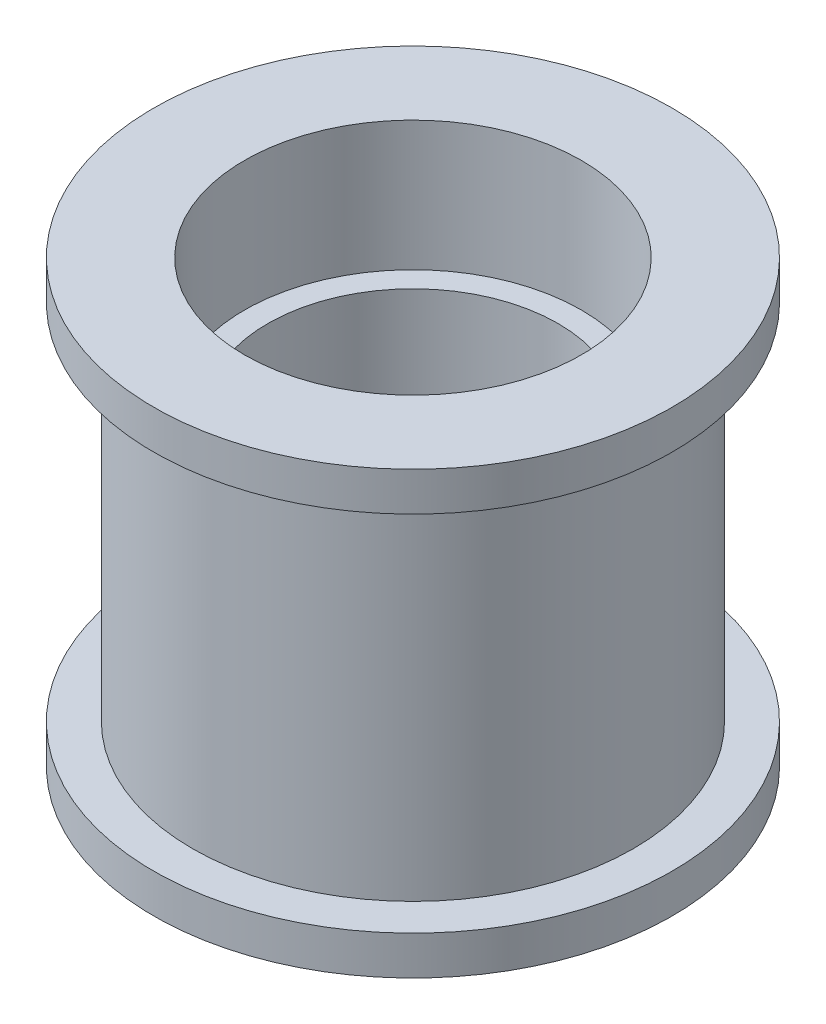
ISO-10303-21;
HEADER;
FILE_DESCRIPTION(('STEP AP214'),'2;1');
FILE_NAME('part.step','',(''),(''),'','','');
FILE_SCHEMA(('AUTOMOTIVE_DESIGN { 1 0 10303 214 1 1 1 1 }'));
ENDSEC;
DATA;
#1=APPLICATION_CONTEXT('core data for automotive mechanical design processes');
#2=APPLICATION_PROTOCOL_DEFINITION('international standard','automotive_design',2000,#1);
#3=PRODUCT_CONTEXT('',#1,'mechanical');
#4=PRODUCT('Part','Part','',(#3));
#5=PRODUCT_RELATED_PRODUCT_CATEGORY('part','',(#4));
#6=PRODUCT_DEFINITION_FORMATION('','',#4);
#7=PRODUCT_DEFINITION_CONTEXT('part definition',#1,'design');
#8=PRODUCT_DEFINITION('design','',#6,#7);
#9=PRODUCT_DEFINITION_SHAPE('','',#8);
#10=(LENGTH_UNIT() NAMED_UNIT(*) SI_UNIT(.MILLI.,.METRE.));
#11=(NAMED_UNIT(*) PLANE_ANGLE_UNIT() SI_UNIT($,.RADIAN.));
#12=(NAMED_UNIT(*) SI_UNIT($,.STERADIAN.) SOLID_ANGLE_UNIT());
#13=UNCERTAINTY_MEASURE_WITH_UNIT(LENGTH_MEASURE(1.E-05),#10,'distance_accuracy_value','');
#14=(GEOMETRIC_REPRESENTATION_CONTEXT(3) GLOBAL_UNCERTAINTY_ASSIGNED_CONTEXT((#13)) GLOBAL_UNIT_ASSIGNED_CONTEXT((#10,
#11,#12)) REPRESENTATION_CONTEXT('',''));
#15=CARTESIAN_POINT('',(0.,0.,0.));
#16=DIRECTION('',(0.,0.,1.));
#17=DIRECTION('',(1.,0.,0.));
#18=AXIS2_PLACEMENT_3D('',#15,#16,#17);
#19=CARTESIAN_POINT('',(5.6,3.5,0.));
#20=DIRECTION('',(0.,1.,0.));
#21=DIRECTION('',(0.,0.,1.));
#22=AXIS2_PLACEMENT_3D('',#19,#20,#21);
#23=PLANE('',#22);
#24=CARTESIAN_POINT('',(0.,3.5,0.));
#25=DIRECTION('',(0.,-1.,0.));
#26=DIRECTION('',(0.,0.,-1.));
#27=AXIS2_PLACEMENT_3D('',#24,#25,#26);
#28=CIRCLE('',#27,5.6);
#29=CARTESIAN_POINT('',(0.,3.5,-5.6));
#30=VERTEX_POINT('',#29);
#31=EDGE_CURVE('E10',#30,#30,#28,.T.);
#32=ORIENTED_EDGE('',*,*,#31,.T.);
#33=EDGE_LOOP('',(#32));
#34=FACE_BOUND('',#33,.T.);
#35=CARTESIAN_POINT('',(0.,3.5,0.));
#36=DIRECTION('',(0.,-1.,0.));
#37=DIRECTION('',(0.,0.,-1.));
#38=AXIS2_PLACEMENT_3D('',#35,#36,#37);
#39=CIRCLE('',#38,6.5);
#40=CARTESIAN_POINT('',(0.,3.5,-6.5));
#41=VERTEX_POINT('',#40);
#42=EDGE_CURVE('E72',#41,#41,#39,.T.);
#43=ORIENTED_EDGE('',*,*,#42,.F.);
#44=EDGE_LOOP('',(#43));
#45=FACE_BOUND('',#44,.T.);
#46=ADVANCED_FACE('F32',(#34,#45),#23,.T.);
#47=CARTESIAN_POINT('',(0.,0.,0.));
#48=DIRECTION('',(0.,-1.,0.));
#49=DIRECTION('',(0.,0.,-1.));
#50=AXIS2_PLACEMENT_3D('',#47,#48,#49);
#51=CYLINDRICAL_SURFACE('',#50,5.6);
#52=CARTESIAN_POINT('',(0.,-3.5,0.));
#53=DIRECTION('',(0.,-1.,0.));
#54=DIRECTION('',(0.,0.,-1.));
#55=AXIS2_PLACEMENT_3D('',#52,#53,#54);
#56=CIRCLE('',#55,5.6);
#57=CARTESIAN_POINT('',(0.,-3.5,-5.6));
#58=VERTEX_POINT('',#57);
#59=EDGE_CURVE('E38',#58,#58,#56,.T.);
#60=ORIENTED_EDGE('',*,*,#59,.T.);
#61=EDGE_LOOP('',(#60));
#62=FACE_BOUND('',#61,.T.);
#63=ORIENTED_EDGE('',*,*,#31,.F.);
#64=EDGE_LOOP('',(#63));
#65=FACE_BOUND('',#64,.T.);
#66=ADVANCED_FACE('F80',(#62,#65),#51,.F.);
#67=CARTESIAN_POINT('',(5.6,-3.5,0.));
#68=DIRECTION('',(0.,-1.,0.));
#69=DIRECTION('',(0.,0.,-1.));
#70=AXIS2_PLACEMENT_3D('',#67,#68,#69);
#71=PLANE('',#70);
#72=CARTESIAN_POINT('',(0.,-3.5,0.));
#73=DIRECTION('',(0.,-1.,0.));
#74=DIRECTION('',(0.,0.,-1.));
#75=AXIS2_PLACEMENT_3D('',#72,#73,#74);
#76=CIRCLE('',#75,6.5);
#77=CARTESIAN_POINT('',(0.,-3.5,-6.5));
#78=VERTEX_POINT('',#77);
#79=EDGE_CURVE('E42',#78,#78,#76,.T.);
#80=ORIENTED_EDGE('',*,*,#79,.T.);
#81=EDGE_LOOP('',(#80));
#82=FACE_BOUND('',#81,.T.);
#83=ORIENTED_EDGE('',*,*,#59,.F.);
#84=EDGE_LOOP('',(#83));
#85=FACE_BOUND('',#84,.T.);
#86=ADVANCED_FACE('F84',(#82,#85),#71,.T.);
#87=CARTESIAN_POINT('',(0.,0.,0.));
#88=DIRECTION('',(0.,-1.,0.));
#89=DIRECTION('',(0.,0.,-1.));
#90=AXIS2_PLACEMENT_3D('',#87,#88,#89);
#91=CYLINDRICAL_SURFACE('',#90,6.5);
#92=CARTESIAN_POINT('',(0.,-8.5,0.));
#93=DIRECTION('',(0.,-1.,0.));
#94=DIRECTION('',(0.,0.,-1.));
#95=AXIS2_PLACEMENT_3D('',#92,#93,#94);
#96=CIRCLE('',#95,6.5);
#97=CARTESIAN_POINT('',(0.,-8.5,-6.5));
#98=VERTEX_POINT('',#97);
#99=EDGE_CURVE('E46',#98,#98,#96,.T.);
#100=ORIENTED_EDGE('',*,*,#99,.T.);
#101=EDGE_LOOP('',(#100));
#102=FACE_BOUND('',#101,.T.);
#103=ORIENTED_EDGE('',*,*,#79,.F.);
#104=EDGE_LOOP('',(#103));
#105=FACE_BOUND('',#104,.T.);
#106=ADVANCED_FACE('F88',(#102,#105),#91,.F.);
#107=CARTESIAN_POINT('',(6.5,-8.5,0.));
#108=DIRECTION('',(0.,-1.,0.));
#109=DIRECTION('',(0.,0.,-1.));
#110=AXIS2_PLACEMENT_3D('',#107,#108,#109);
#111=PLANE('',#110);
#112=CARTESIAN_POINT('',(0.,-8.5,0.));
#113=DIRECTION('',(0.,-1.,0.));
#114=DIRECTION('',(0.,0.,-1.));
#115=AXIS2_PLACEMENT_3D('',#112,#113,#114);
#116=CIRCLE('',#115,10.);
#117=CARTESIAN_POINT('',(0.,-8.5,-10.));
#118=VERTEX_POINT('',#117);
#119=EDGE_CURVE('E51',#118,#118,#116,.T.);
#120=ORIENTED_EDGE('',*,*,#119,.T.);
#121=EDGE_LOOP('',(#120));
#122=FACE_BOUND('',#121,.T.);
#123=ORIENTED_EDGE('',*,*,#99,.F.);
#124=EDGE_LOOP('',(#123));
#125=FACE_BOUND('',#124,.T.);
#126=ADVANCED_FACE('F95',(#122,#125),#111,.T.);
#127=CARTESIAN_POINT('',(0.,0.,0.));
#128=DIRECTION('',(0.,-1.,0.));
#129=DIRECTION('',(0.,0.,-1.));
#130=AXIS2_PLACEMENT_3D('',#127,#128,#129);
#131=CYLINDRICAL_SURFACE('',#130,10.);
#132=CARTESIAN_POINT('',(0.,-7.,0.));
#133=DIRECTION('',(0.,-1.,0.));
#134=DIRECTION('',(0.,0.,-1.));
#135=AXIS2_PLACEMENT_3D('',#132,#133,#134);
#136=CIRCLE('',#135,10.);
#137=CARTESIAN_POINT('',(0.,-7.,-10.));
#138=VERTEX_POINT('',#137);
#139=EDGE_CURVE('E54',#138,#138,#136,.T.);
#140=ORIENTED_EDGE('',*,*,#139,.T.);
#141=EDGE_LOOP('',(#140));
#142=FACE_BOUND('',#141,.T.);
#143=ORIENTED_EDGE('',*,*,#119,.F.);
#144=EDGE_LOOP('',(#143));
#145=FACE_BOUND('',#144,.T.);
#146=ADVANCED_FACE('F99',(#142,#145),#131,.T.);
#147=CARTESIAN_POINT('',(10.,-7.,0.));
#148=DIRECTION('',(0.,1.,0.));
#149=DIRECTION('',(0.,0.,1.));
#150=AXIS2_PLACEMENT_3D('',#147,#148,#149);
#151=PLANE('',#150);
#152=CARTESIAN_POINT('',(0.,-7.,0.));
#153=DIRECTION('',(0.,-1.,0.));
#154=DIRECTION('',(0.,0.,-1.));
#155=AXIS2_PLACEMENT_3D('',#152,#153,#154);
#156=CIRCLE('',#155,8.5);
#157=CARTESIAN_POINT('',(0.,-7.,-8.5));
#158=VERTEX_POINT('',#157);
#159=EDGE_CURVE('E57',#158,#158,#156,.T.);
#160=ORIENTED_EDGE('',*,*,#159,.T.);
#161=EDGE_LOOP('',(#160));
#162=FACE_BOUND('',#161,.T.);
#163=ORIENTED_EDGE('',*,*,#139,.F.);
#164=EDGE_LOOP('',(#163));
#165=FACE_BOUND('',#164,.T.);
#166=ADVANCED_FACE('F103',(#162,#165),#151,.T.);
#167=CARTESIAN_POINT('',(0.,0.,0.));
#168=DIRECTION('',(0.,-1.,0.));
#169=DIRECTION('',(0.,0.,-1.));
#170=AXIS2_PLACEMENT_3D('',#167,#168,#169);
#171=CYLINDRICAL_SURFACE('',#170,8.5);
#172=CARTESIAN_POINT('',(0.,7.,0.));
#173=DIRECTION('',(0.,-1.,0.));
#174=DIRECTION('',(0.,0.,-1.));
#175=AXIS2_PLACEMENT_3D('',#172,#173,#174);
#176=CIRCLE('',#175,8.5);
#177=CARTESIAN_POINT('',(0.,7.,-8.5));
#178=VERTEX_POINT('',#177);
#179=EDGE_CURVE('E60',#178,#178,#176,.T.);
#180=ORIENTED_EDGE('',*,*,#179,.T.);
#181=EDGE_LOOP('',(#180));
#182=FACE_BOUND('',#181,.T.);
#183=ORIENTED_EDGE('',*,*,#159,.F.);
#184=EDGE_LOOP('',(#183));
#185=FACE_BOUND('',#184,.T.);
#186=ADVANCED_FACE('F107',(#182,#185),#171,.T.);
#187=CARTESIAN_POINT('',(10.,7.,0.));
#188=DIRECTION('',(0.,-1.,0.));
#189=DIRECTION('',(0.,0.,-1.));
#190=AXIS2_PLACEMENT_3D('',#187,#188,#189);
#191=PLANE('',#190);
#192=CARTESIAN_POINT('',(0.,7.,0.));
#193=DIRECTION('',(0.,-1.,0.));
#194=DIRECTION('',(0.,0.,-1.));
#195=AXIS2_PLACEMENT_3D('',#192,#193,#194);
#196=CIRCLE('',#195,10.);
#197=CARTESIAN_POINT('',(0.,7.,-10.));
#198=VERTEX_POINT('',#197);
#199=EDGE_CURVE('E63',#198,#198,#196,.T.);
#200=ORIENTED_EDGE('',*,*,#199,.T.);
#201=EDGE_LOOP('',(#200));
#202=FACE_BOUND('',#201,.T.);
#203=ORIENTED_EDGE('',*,*,#179,.F.);
#204=EDGE_LOOP('',(#203));
#205=FACE_BOUND('',#204,.T.);
#206=ADVANCED_FACE('F111',(#202,#205),#191,.T.);
#207=CARTESIAN_POINT('',(0.,0.,0.));
#208=DIRECTION('',(0.,-1.,0.));
#209=DIRECTION('',(0.,0.,-1.));
#210=AXIS2_PLACEMENT_3D('',#207,#208,#209);
#211=CYLINDRICAL_SURFACE('',#210,10.);
#212=CARTESIAN_POINT('',(0.,8.5,0.));
#213=DIRECTION('',(0.,-1.,0.));
#214=DIRECTION('',(0.,0.,-1.));
#215=AXIS2_PLACEMENT_3D('',#212,#213,#214);
#216=CIRCLE('',#215,10.);
#217=CARTESIAN_POINT('',(0.,8.5,-10.));
#218=VERTEX_POINT('',#217);
#219=EDGE_CURVE('E66',#218,#218,#216,.T.);
#220=ORIENTED_EDGE('',*,*,#219,.T.);
#221=EDGE_LOOP('',(#220));
#222=FACE_BOUND('',#221,.T.);
#223=ORIENTED_EDGE('',*,*,#199,.F.);
#224=EDGE_LOOP('',(#223));
#225=FACE_BOUND('',#224,.T.);
#226=ADVANCED_FACE('F115',(#222,#225),#211,.T.);
#227=CARTESIAN_POINT('',(6.5,8.5,0.));
#228=DIRECTION('',(0.,1.,0.));
#229=DIRECTION('',(0.,0.,1.));
#230=AXIS2_PLACEMENT_3D('',#227,#228,#229);
#231=PLANE('',#230);
#232=CARTESIAN_POINT('',(0.,8.5,0.));
#233=DIRECTION('',(0.,-1.,0.));
#234=DIRECTION('',(0.,0.,-1.));
#235=AXIS2_PLACEMENT_3D('',#232,#233,#234);
#236=CIRCLE('',#235,6.5);
#237=CARTESIAN_POINT('',(0.,8.5,-6.5));
#238=VERTEX_POINT('',#237);
#239=EDGE_CURVE('E69',#238,#238,#236,.T.);
#240=ORIENTED_EDGE('',*,*,#239,.T.);
#241=EDGE_LOOP('',(#240));
#242=FACE_BOUND('',#241,.T.);
#243=ORIENTED_EDGE('',*,*,#219,.F.);
#244=EDGE_LOOP('',(#243));
#245=FACE_BOUND('',#244,.T.);
#246=ADVANCED_FACE('F119',(#242,#245),#231,.T.);
#247=CARTESIAN_POINT('',(0.,0.,0.));
#248=DIRECTION('',(0.,-1.,0.));
#249=DIRECTION('',(0.,0.,-1.));
#250=AXIS2_PLACEMENT_3D('',#247,#248,#249);
#251=CYLINDRICAL_SURFACE('',#250,6.5);
#252=ORIENTED_EDGE('',*,*,#42,.T.);
#253=EDGE_LOOP('',(#252));
#254=FACE_BOUND('',#253,.T.);
#255=ORIENTED_EDGE('',*,*,#239,.F.);
#256=EDGE_LOOP('',(#255));
#257=FACE_BOUND('',#256,.T.);
#258=ADVANCED_FACE('F76',(#254,#257),#251,.F.);
#259=CLOSED_SHELL('',(#46,#66,#86,#106,#126,#146,#166,#186,#206,#226,#246,#258));
#260=MANIFOLD_SOLID_BREP('B2',#259);
#261=ADVANCED_BREP_SHAPE_REPRESENTATION('',(#18,#260),#14);
#262=SHAPE_DEFINITION_REPRESENTATION(#9,#261);
ENDSEC;
END-ISO-10303-21;
